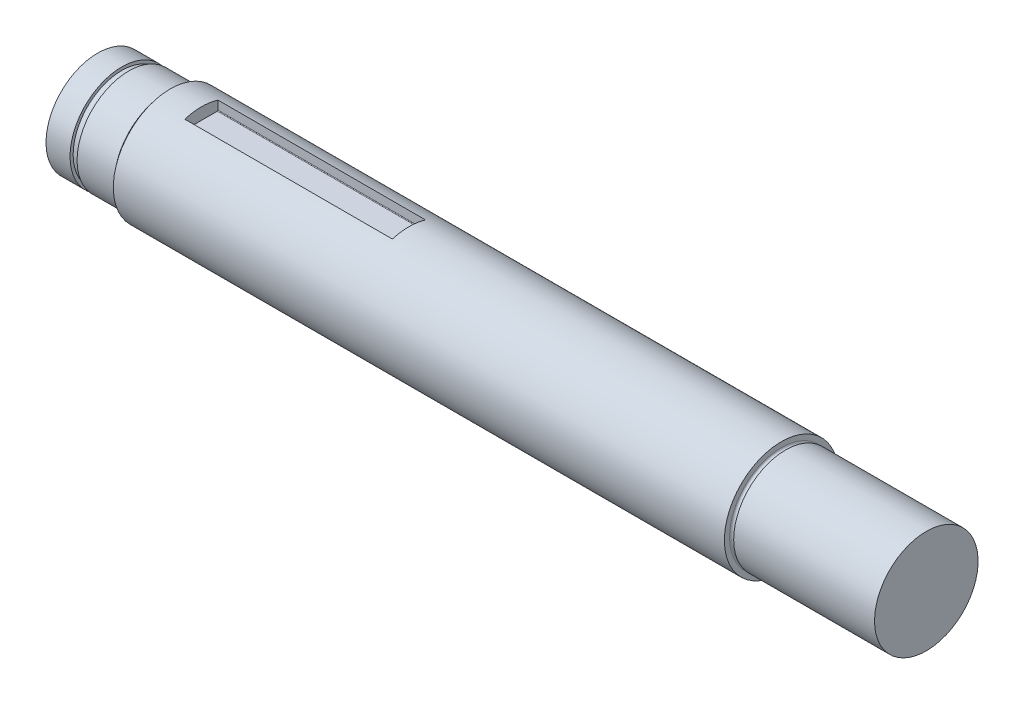
ISO-10303-21;
HEADER;
FILE_DESCRIPTION(('STEP AP214'),'2;1');
FILE_NAME('part.step','',(''),(''),'','','');
FILE_SCHEMA(('AUTOMOTIVE_DESIGN { 1 0 10303 214 1 1 1 1 }'));
ENDSEC;
DATA;
#1=APPLICATION_CONTEXT('core data for automotive mechanical design processes');
#2=APPLICATION_PROTOCOL_DEFINITION('international standard','automotive_design',2000,#1);
#3=PRODUCT_CONTEXT('',#1,'mechanical');
#4=PRODUCT('Part','Part','',(#3));
#5=PRODUCT_RELATED_PRODUCT_CATEGORY('part','',(#4));
#6=PRODUCT_DEFINITION_FORMATION('','',#4);
#7=PRODUCT_DEFINITION_CONTEXT('part definition',#1,'design');
#8=PRODUCT_DEFINITION('design','',#6,#7);
#9=PRODUCT_DEFINITION_SHAPE('','',#8);
#10=(LENGTH_UNIT() NAMED_UNIT(*) SI_UNIT(.MILLI.,.METRE.));
#11=(NAMED_UNIT(*) PLANE_ANGLE_UNIT() SI_UNIT($,.RADIAN.));
#12=(NAMED_UNIT(*) SI_UNIT($,.STERADIAN.) SOLID_ANGLE_UNIT());
#13=UNCERTAINTY_MEASURE_WITH_UNIT(LENGTH_MEASURE(1.E-05),#10,'distance_accuracy_value','');
#14=(GEOMETRIC_REPRESENTATION_CONTEXT(3) GLOBAL_UNCERTAINTY_ASSIGNED_CONTEXT((#13)) GLOBAL_UNIT_ASSIGNED_CONTEXT((#10,
#11,#12)) REPRESENTATION_CONTEXT('',''));
#15=CARTESIAN_POINT('',(0.,0.,0.));
#16=DIRECTION('',(0.,0.,1.));
#17=DIRECTION('',(1.,0.,0.));
#18=AXIS2_PLACEMENT_3D('',#15,#16,#17);
#19=CARTESIAN_POINT('',(175.,0.,0.));
#20=DIRECTION('',(-1.,0.,0.));
#21=DIRECTION('',(0.,0.,1.));
#22=AXIS2_PLACEMENT_3D('',#19,#20,#21);
#23=CYLINDRICAL_SURFACE('',#22,25.);
#24=CARTESIAN_POINT('',(-102.,0.,0.));
#25=DIRECTION('',(-1.,0.,0.));
#26=DIRECTION('',(0.,0.,1.));
#27=AXIS2_PLACEMENT_3D('',#24,#25,#26);
#28=CIRCLE('',#27,25.);
#29=CARTESIAN_POINT('',(-102.,0.,25.));
#30=VERTEX_POINT('',#29);
#31=EDGE_CURVE('E154',#30,#30,#28,.T.);
#32=ORIENTED_EDGE('',*,*,#31,.T.);
#33=EDGE_LOOP('',(#32));
#34=FACE_BOUND('',#33,.T.);
#35=CARTESIAN_POINT('',(-120.,0.,0.));
#36=DIRECTION('',(-1.,0.,0.));
#37=DIRECTION('',(0.,0.,1.));
#38=AXIS2_PLACEMENT_3D('',#35,#36,#37);
#39=CIRCLE('',#38,25.);
#40=CARTESIAN_POINT('',(-120.,0.,25.));
#41=VERTEX_POINT('',#40);
#42=EDGE_CURVE('E181',#41,#41,#39,.T.);
#43=ORIENTED_EDGE('',*,*,#42,.F.);
#44=EDGE_LOOP('',(#43));
#45=FACE_BOUND('',#44,.T.);
#46=ADVANCED_FACE('F39',(#34,#45),#23,.T.);
#47=CARTESIAN_POINT('',(100.,0.,0.));
#48=DIRECTION('',(-1.,0.,0.));
#49=DIRECTION('',(0.,0.,1.));
#50=AXIS2_PLACEMENT_3D('',#47,#48,#49);
#51=CYLINDRICAL_SURFACE('',#50,27.5);
#52=CARTESIAN_POINT('',(195.,0.,0.));
#53=DIRECTION('',(1.,0.,0.));
#54=DIRECTION('',(0.,0.,-1.));
#55=AXIS2_PLACEMENT_3D('',#52,#53,#54);
#56=CIRCLE('',#55,27.5);
#57=CARTESIAN_POINT('',(195.,0.,-27.5));
#58=VERTEX_POINT('',#57);
#59=EDGE_CURVE('E47',#58,#58,#56,.T.);
#60=ORIENTED_EDGE('',*,*,#59,.F.);
#61=EDGE_LOOP('',(#60));
#62=FACE_BOUND('',#61,.T.);
#63=CARTESIAN_POINT('',(-100.,0.,0.));
#64=DIRECTION('',(1.,0.,0.));
#65=DIRECTION('',(0.,0.,-1.));
#66=AXIS2_PLACEMENT_3D('',#63,#64,#65);
#67=CIRCLE('',#66,27.5);
#68=CARTESIAN_POINT('',(-100.,0.,-27.5));
#69=VERTEX_POINT('',#68);
#70=EDGE_CURVE('E11',#69,#69,#67,.T.);
#71=ORIENTED_EDGE('',*,*,#70,.T.);
#72=EDGE_LOOP('',(#71));
#73=FACE_BOUND('',#72,.T.);
#74=CARTESIAN_POINT('',(15.215,0.,0.));
#75=DIRECTION('',(-1.,0.,0.));
#76=DIRECTION('',(0.,0.,1.));
#77=AXIS2_PLACEMENT_3D('',#74,#75,#76);
#78=CIRCLE('',#77,27.5);
#79=CARTESIAN_POINT('',(15.215,26.3106442338457,8.));
#80=VERTEX_POINT('',#79);
#81=CARTESIAN_POINT('',(15.215,26.3106442338457,-8.));
#82=VERTEX_POINT('',#81);
#83=EDGE_CURVE('E142',#80,#82,#78,.T.);
#84=ORIENTED_EDGE('',*,*,#83,.F.);
#85=DIRECTION('',(-1.,0.,0.));
#86=VECTOR('',#85,1.);
#87=CARTESIAN_POINT('',(15.215,26.3106442338457,8.));
#88=LINE('',#87,#86);
#89=CARTESIAN_POINT('',(-85.,26.3106442338457,8.));
#90=VERTEX_POINT('',#89);
#91=EDGE_CURVE('E63',#80,#90,#88,.T.);
#92=ORIENTED_EDGE('',*,*,#91,.T.);
#93=CARTESIAN_POINT('',(-85.,0.,0.));
#94=DIRECTION('',(-1.,0.,0.));
#95=DIRECTION('',(0.,0.,1.));
#96=AXIS2_PLACEMENT_3D('',#93,#94,#95);
#97=CIRCLE('',#96,27.5);
#98=CARTESIAN_POINT('',(-85.,26.3106442338457,-8.));
#99=VERTEX_POINT('',#98);
#100=EDGE_CURVE('E85',#90,#99,#97,.T.);
#101=ORIENTED_EDGE('',*,*,#100,.T.);
#102=DIRECTION('',(-1.,0.,0.));
#103=VECTOR('',#102,1.);
#104=CARTESIAN_POINT('',(15.215,26.3106442338457,-8.));
#105=LINE('',#104,#103);
#106=EDGE_CURVE('E130',#82,#99,#105,.T.);
#107=ORIENTED_EDGE('',*,*,#106,.F.);
#108=EDGE_LOOP('',(#84,#92,#101,#107));
#109=FACE_BOUND('',#108,.T.);
#110=ADVANCED_FACE('F41',(#62,#73,#109),#51,.T.);
#111=CARTESIAN_POINT('',(-101.,0.,0.));
#112=DIRECTION('',(-1.,0.,0.));
#113=DIRECTION('',(0.,0.,1.));
#114=AXIS2_PLACEMENT_3D('',#111,#112,#113);
#115=TOROIDAL_SURFACE('',#114,25.,1.);
#116=CARTESIAN_POINT('',(-100.,0.,0.));
#117=DIRECTION('',(-1.,0.,0.));
#118=DIRECTION('',(0.,0.,1.));
#119=AXIS2_PLACEMENT_3D('',#116,#117,#118);
#120=CIRCLE('',#119,25.);
#121=CARTESIAN_POINT('',(-100.,0.,25.));
#122=VERTEX_POINT('',#121);
#123=EDGE_CURVE('E144',#122,#122,#120,.T.);
#124=ORIENTED_EDGE('',*,*,#123,.T.);
#125=EDGE_LOOP('',(#124));
#126=FACE_BOUND('',#125,.T.);
#127=ORIENTED_EDGE('',*,*,#31,.F.);
#128=EDGE_LOOP('',(#127));
#129=FACE_BOUND('',#128,.T.);
#130=ADVANCED_FACE('F171',(#126,#129),#115,.F.);
#131=CARTESIAN_POINT('',(-100.,0.,0.));
#132=DIRECTION('',(1.,0.,0.));
#133=DIRECTION('',(0.,0.,-1.));
#134=AXIS2_PLACEMENT_3D('',#131,#132,#133);
#135=PLANE('',#134);
#136=ORIENTED_EDGE('',*,*,#123,.F.);
#137=EDGE_LOOP('',(#136));
#138=FACE_BOUND('',#137,.T.);
#139=ORIENTED_EDGE('',*,*,#70,.F.);
#140=EDGE_LOOP('',(#139));
#141=FACE_BOUND('',#140,.T.);
#142=ADVANCED_FACE('F259',(#138,#141),#135,.F.);
#143=CARTESIAN_POINT('',(195.,0.,0.));
#144=DIRECTION('',(1.,0.,0.));
#145=DIRECTION('',(0.,0.,-1.));
#146=AXIS2_PLACEMENT_3D('',#143,#144,#145);
#147=PLANE('',#146);
#148=ORIENTED_EDGE('',*,*,#59,.T.);
#149=EDGE_LOOP('',(#148));
#150=FACE_BOUND('',#149,.T.);
#151=CARTESIAN_POINT('',(195.,0.,0.));
#152=DIRECTION('',(-1.,0.,0.));
#153=DIRECTION('',(0.,0.,1.));
#154=AXIS2_PLACEMENT_3D('',#151,#152,#153);
#155=CIRCLE('',#154,25.);
#156=CARTESIAN_POINT('',(195.,0.,25.));
#157=VERTEX_POINT('',#156);
#158=EDGE_CURVE('E150',#157,#157,#155,.T.);
#159=ORIENTED_EDGE('',*,*,#158,.T.);
#160=EDGE_LOOP('',(#159));
#161=FACE_BOUND('',#160,.T.);
#162=ADVANCED_FACE('F166',(#150,#161),#147,.T.);
#163=CARTESIAN_POINT('',(196.,0.,0.));
#164=DIRECTION('',(-1.,0.,0.));
#165=DIRECTION('',(0.,0.,1.));
#166=AXIS2_PLACEMENT_3D('',#163,#164,#165);
#167=TOROIDAL_SURFACE('',#166,25.,1.);
#168=CARTESIAN_POINT('',(197.,0.,0.));
#169=DIRECTION('',(-1.,0.,0.));
#170=DIRECTION('',(0.,0.,1.));
#171=AXIS2_PLACEMENT_3D('',#168,#169,#170);
#172=CIRCLE('',#171,25.);
#173=CARTESIAN_POINT('',(197.,0.,25.));
#174=VERTEX_POINT('',#173);
#175=EDGE_CURVE('E153',#174,#174,#172,.T.);
#176=ORIENTED_EDGE('',*,*,#175,.T.);
#177=EDGE_LOOP('',(#176));
#178=FACE_BOUND('',#177,.T.);
#179=ORIENTED_EDGE('',*,*,#158,.F.);
#180=EDGE_LOOP('',(#179));
#181=FACE_BOUND('',#180,.T.);
#182=ADVANCED_FACE('F252',(#178,#181),#167,.F.);
#183=CARTESIAN_POINT('',(265.,0.,0.));
#184=DIRECTION('',(1.,0.,0.));
#185=DIRECTION('',(0.,0.,-1.));
#186=AXIS2_PLACEMENT_3D('',#183,#184,#185);
#187=PLANE('',#186);
#188=CARTESIAN_POINT('',(265.,0.,0.));
#189=DIRECTION('',(1.,0.,0.));
#190=DIRECTION('',(0.,0.,-1.));
#191=AXIS2_PLACEMENT_3D('',#188,#189,#190);
#192=CIRCLE('',#191,25.);
#193=CARTESIAN_POINT('',(265.,0.,25.));
#194=VERTEX_POINT('',#193);
#195=EDGE_CURVE('E157',#194,#194,#192,.T.);
#196=ORIENTED_EDGE('',*,*,#195,.T.);
#197=EDGE_LOOP('',(#196));
#198=FACE_BOUND('',#197,.T.);
#199=ADVANCED_FACE('F255',(#198),#187,.T.);
#200=CARTESIAN_POINT('',(265.,0.,0.));
#201=DIRECTION('',(-1.,0.,0.));
#202=DIRECTION('',(0.,0.,1.));
#203=AXIS2_PLACEMENT_3D('',#200,#201,#202);
#204=CYLINDRICAL_SURFACE('',#203,25.);
#205=CARTESIAN_POINT('',(265.,0.,25.));
#206=CARTESIAN_POINT('',(264.291666666667,0.,25.));
#207=CARTESIAN_POINT('',(263.583333333333,0.,25.));
#208=CARTESIAN_POINT('',(262.166666666667,0.,25.));
#209=CARTESIAN_POINT('',(261.458333333333,0.,25.));
#210=CARTESIAN_POINT('',(260.041666666667,0.,25.));
#211=CARTESIAN_POINT('',(259.333333333333,0.,25.));
#212=CARTESIAN_POINT('',(257.916666666667,0.,25.));
#213=CARTESIAN_POINT('',(257.208333333333,0.,25.));
#214=CARTESIAN_POINT('',(255.791666666667,0.,25.));
#215=CARTESIAN_POINT('',(255.083333333333,0.,25.));
#216=CARTESIAN_POINT('',(253.666666666667,0.,25.));
#217=CARTESIAN_POINT('',(252.958333333333,0.,25.));
#218=CARTESIAN_POINT('',(251.541666666667,0.,25.));
#219=CARTESIAN_POINT('',(250.833333333333,0.,25.));
#220=CARTESIAN_POINT('',(249.416666666667,0.,25.));
#221=CARTESIAN_POINT('',(248.708333333333,0.,25.));
#222=CARTESIAN_POINT('',(247.291666666667,0.,25.));
#223=CARTESIAN_POINT('',(246.583333333333,0.,25.));
#224=CARTESIAN_POINT('',(245.166666666667,0.,25.));
#225=CARTESIAN_POINT('',(244.458333333333,0.,25.));
#226=CARTESIAN_POINT('',(243.041666666667,0.,25.));
#227=CARTESIAN_POINT('',(242.333333333333,0.,25.));
#228=CARTESIAN_POINT('',(240.916666666667,0.,25.));
#229=CARTESIAN_POINT('',(240.208333333333,0.,25.));
#230=CARTESIAN_POINT('',(238.791666666667,0.,25.));
#231=CARTESIAN_POINT('',(238.083333333333,0.,25.));
#232=CARTESIAN_POINT('',(236.666666666667,0.,25.));
#233=CARTESIAN_POINT('',(235.958333333333,0.,25.));
#234=CARTESIAN_POINT('',(234.541666666667,0.,25.));
#235=CARTESIAN_POINT('',(233.833333333333,0.,25.));
#236=CARTESIAN_POINT('',(232.416666666667,0.,25.));
#237=CARTESIAN_POINT('',(231.708333333333,0.,25.));
#238=CARTESIAN_POINT('',(230.291666666667,0.,25.));
#239=CARTESIAN_POINT('',(229.583333333333,0.,25.));
#240=CARTESIAN_POINT('',(228.166666666667,0.,25.));
#241=CARTESIAN_POINT('',(227.458333333333,0.,25.));
#242=CARTESIAN_POINT('',(226.041666666667,0.,25.));
#243=CARTESIAN_POINT('',(225.333333333333,0.,25.));
#244=CARTESIAN_POINT('',(223.916666666667,0.,25.));
#245=CARTESIAN_POINT('',(223.208333333333,0.,25.));
#246=CARTESIAN_POINT('',(221.791666666667,0.,25.));
#247=CARTESIAN_POINT('',(221.083333333333,0.,25.));
#248=CARTESIAN_POINT('',(219.666666666667,0.,25.));
#249=CARTESIAN_POINT('',(218.958333333333,0.,25.));
#250=CARTESIAN_POINT('',(217.541666666667,0.,25.));
#251=CARTESIAN_POINT('',(216.833333333333,0.,25.));
#252=CARTESIAN_POINT('',(215.416666666667,0.,25.));
#253=CARTESIAN_POINT('',(214.708333333333,0.,25.));
#254=CARTESIAN_POINT('',(213.291666666667,0.,25.));
#255=CARTESIAN_POINT('',(212.583333333333,0.,25.));
#256=CARTESIAN_POINT('',(211.166666666667,0.,25.));
#257=CARTESIAN_POINT('',(210.458333333333,0.,25.));
#258=CARTESIAN_POINT('',(209.041666666667,0.,25.));
#259=CARTESIAN_POINT('',(208.333333333333,0.,25.));
#260=CARTESIAN_POINT('',(206.916666666667,0.,25.));
#261=CARTESIAN_POINT('',(206.208333333333,0.,25.));
#262=CARTESIAN_POINT('',(204.791666666667,0.,25.));
#263=CARTESIAN_POINT('',(204.083333333333,0.,25.));
#264=CARTESIAN_POINT('',(202.666666666667,0.,25.));
#265=CARTESIAN_POINT('',(201.958333333333,0.,25.));
#266=CARTESIAN_POINT('',(200.541666666667,0.,25.));
#267=CARTESIAN_POINT('',(199.833333333333,0.,25.));
#268=CARTESIAN_POINT('',(198.416666666667,0.,25.));
#269=CARTESIAN_POINT('',(197.708333333333,0.,25.));
#270=CARTESIAN_POINT('',(197.,0.,25.));
#271=B_SPLINE_CURVE_WITH_KNOTS('',3,(#205,#206,#207,#208,#209,#210,#211,#212,#213,#214,#215,
#216,#217,#218,#219,#220,#221,#222,#223,#224,#225,#226,#227,#228,#229,#230,#231,#232,#233,#234,
#235,#236,#237,#238,#239,#240,#241,#242,#243,#244,#245,#246,#247,#248,#249,#250,#251,#252,#253,
#254,#255,#256,#257,#258,#259,#260,#261,#262,#263,#264,#265,#266,#267,#268,#269,#270),
.UNSPECIFIED.,.F.,.F.,(4,2,2,2,2,2,2,2,2,2,2,2,2,2,2,2,2,2,2,2,2,2,2,2,2,2,2,2,2,2,2,2,4),(0.,
2.12500000000004,4.25000000000003,6.37500000000002,8.50000000000001,10.625,12.75,14.875,17.,
19.125,21.25,23.375,25.5,27.625,29.75,31.875,34.,36.125,38.25,40.375,42.5,44.625,46.75,48.875,
51.,53.125,55.25,57.375,59.5,61.625,63.75,65.875,68.),.UNSPECIFIED.);
#272=EDGE_CURVE('BSEAM241',#194,#174,#271,.T.);
#273=ORIENTED_EDGE('',*,*,#195,.F.);
#274=ORIENTED_EDGE('',*,*,#175,.F.);
#275=ORIENTED_EDGE('',*,*,#272,.T.);
#276=ORIENTED_EDGE('',*,*,#272,.F.);
#277=EDGE_LOOP('',(#273,#275,#274,#276));
#278=FACE_BOUND('',#277,.T.);
#279=ADVANCED_FACE('F241',(#278),#204,.T.);
#280=CARTESIAN_POINT('',(15.215,22.1,8.));
#281=DIRECTION('',(0.,0.,1.));
#282=DIRECTION('',(0.,-1.,0.));
#283=AXIS2_PLACEMENT_3D('',#280,#281,#282);
#284=PLANE('',#283);
#285=DIRECTION('',(0.,1.,0.));
#286=VECTOR('',#285,1.);
#287=CARTESIAN_POINT('',(-85.,22.1,8.));
#288=LINE('',#287,#286);
#289=CARTESIAN_POINT('',(-85.,22.1,8.));
#290=VERTEX_POINT('',#289);
#291=EDGE_CURVE('E140',#290,#90,#288,.T.);
#292=ORIENTED_EDGE('',*,*,#291,.T.);
#293=ORIENTED_EDGE('',*,*,#91,.F.);
#294=DIRECTION('',(0.,1.,0.));
#295=VECTOR('',#294,1.);
#296=CARTESIAN_POINT('',(15.215,22.1,8.));
#297=LINE('',#296,#295);
#298=CARTESIAN_POINT('',(15.215,22.1,8.));
#299=VERTEX_POINT('',#298);
#300=EDGE_CURVE('E120',#299,#80,#297,.T.);
#301=ORIENTED_EDGE('',*,*,#300,.F.);
#302=DIRECTION('',(-1.,0.,0.));
#303=VECTOR('',#302,1.);
#304=CARTESIAN_POINT('',(15.215,22.1,8.));
#305=LINE('',#304,#303);
#306=EDGE_CURVE('E113',#299,#290,#305,.T.);
#307=ORIENTED_EDGE('',*,*,#306,.T.);
#308=EDGE_LOOP('',(#292,#293,#301,#307));
#309=FACE_BOUND('',#308,.T.);
#310=ADVANCED_FACE('F238',(#309),#284,.F.);
#311=CARTESIAN_POINT('',(15.215,22.1,7.7));
#312=DIRECTION('',(-1.,0.,0.));
#313=DIRECTION('',(0.,0.,1.));
#314=AXIS2_PLACEMENT_3D('',#311,#312,#313);
#315=CYLINDRICAL_SURFACE('',#314,0.3);
#316=CARTESIAN_POINT('',(-85.,22.1,7.7));
#317=DIRECTION('',(-1.,0.,0.));
#318=DIRECTION('',(0.,0.,1.));
#319=AXIS2_PLACEMENT_3D('',#316,#317,#318);
#320=CIRCLE('',#319,0.3);
#321=CARTESIAN_POINT('',(-85.,21.8,7.7));
#322=VERTEX_POINT('',#321);
#323=EDGE_CURVE('E138',#322,#290,#320,.T.);
#324=ORIENTED_EDGE('',*,*,#323,.T.);
#325=ORIENTED_EDGE('',*,*,#306,.F.);
#326=CARTESIAN_POINT('',(15.215,22.1,7.7));
#327=DIRECTION('',(-1.,0.,0.));
#328=DIRECTION('',(0.,0.,1.));
#329=AXIS2_PLACEMENT_3D('',#326,#327,#328);
#330=CIRCLE('',#329,0.3);
#331=CARTESIAN_POINT('',(15.215,21.8,7.7));
#332=VERTEX_POINT('',#331);
#333=EDGE_CURVE('E117',#332,#299,#330,.T.);
#334=ORIENTED_EDGE('',*,*,#333,.F.);
#335=DIRECTION('',(-1.,0.,0.));
#336=VECTOR('',#335,1.);
#337=CARTESIAN_POINT('',(15.215,21.8,7.7));
#338=LINE('',#337,#336);
#339=EDGE_CURVE('E102',#332,#322,#338,.T.);
#340=ORIENTED_EDGE('',*,*,#339,.T.);
#341=EDGE_LOOP('',(#324,#325,#334,#340));
#342=FACE_BOUND('',#341,.T.);
#343=ADVANCED_FACE('F118',(#342),#315,.F.);
#344=CARTESIAN_POINT('',(15.215,21.8,-7.7));
#345=DIRECTION('',(0.,-1.,0.));
#346=DIRECTION('',(0.,0.,-1.));
#347=AXIS2_PLACEMENT_3D('',#344,#345,#346);
#348=PLANE('',#347);
#349=DIRECTION('',(0.,0.,1.));
#350=VECTOR('',#349,1.);
#351=CARTESIAN_POINT('',(-85.,21.8,-7.7));
#352=LINE('',#351,#350);
#353=CARTESIAN_POINT('',(-85.,21.8,-7.7));
#354=VERTEX_POINT('',#353);
#355=EDGE_CURVE('E109',#354,#322,#352,.T.);
#356=ORIENTED_EDGE('',*,*,#355,.T.);
#357=ORIENTED_EDGE('',*,*,#339,.F.);
#358=DIRECTION('',(0.,0.,1.));
#359=VECTOR('',#358,1.);
#360=CARTESIAN_POINT('',(15.215,21.8,-7.7));
#361=LINE('',#360,#359);
#362=CARTESIAN_POINT('',(15.215,21.8,-7.7));
#363=VERTEX_POINT('',#362);
#364=EDGE_CURVE('E106',#363,#332,#361,.T.);
#365=ORIENTED_EDGE('',*,*,#364,.F.);
#366=DIRECTION('',(-1.,0.,0.));
#367=VECTOR('',#366,1.);
#368=CARTESIAN_POINT('',(15.215,21.8,-7.7));
#369=LINE('',#368,#367);
#370=EDGE_CURVE('E114',#363,#354,#369,.T.);
#371=ORIENTED_EDGE('',*,*,#370,.T.);
#372=EDGE_LOOP('',(#356,#357,#365,#371));
#373=FACE_BOUND('',#372,.T.);
#374=ADVANCED_FACE('F104',(#373),#348,.F.);
#375=CARTESIAN_POINT('',(15.215,22.1,-7.7));
#376=DIRECTION('',(-1.,0.,0.));
#377=DIRECTION('',(0.,0.,1.));
#378=AXIS2_PLACEMENT_3D('',#375,#376,#377);
#379=CYLINDRICAL_SURFACE('',#378,0.3);
#380=CARTESIAN_POINT('',(-85.,22.1,-7.7));
#381=DIRECTION('',(-1.,0.,0.));
#382=DIRECTION('',(0.,0.,1.));
#383=AXIS2_PLACEMENT_3D('',#380,#381,#382);
#384=CIRCLE('',#383,0.3);
#385=CARTESIAN_POINT('',(-85.,22.1,-8.));
#386=VERTEX_POINT('',#385);
#387=EDGE_CURVE('E134',#386,#354,#384,.T.);
#388=ORIENTED_EDGE('',*,*,#387,.T.);
#389=ORIENTED_EDGE('',*,*,#370,.F.);
#390=CARTESIAN_POINT('',(15.215,22.1,-7.7));
#391=DIRECTION('',(-1.,0.,0.));
#392=DIRECTION('',(0.,0.,1.));
#393=AXIS2_PLACEMENT_3D('',#390,#391,#392);
#394=CIRCLE('',#393,0.3);
#395=CARTESIAN_POINT('',(15.215,22.1,-8.));
#396=VERTEX_POINT('',#395);
#397=EDGE_CURVE('E124',#396,#363,#394,.T.);
#398=ORIENTED_EDGE('',*,*,#397,.F.);
#399=DIRECTION('',(-1.,0.,0.));
#400=VECTOR('',#399,1.);
#401=CARTESIAN_POINT('',(15.215,22.1,-8.));
#402=LINE('',#401,#400);
#403=EDGE_CURVE('E147',#396,#386,#402,.T.);
#404=ORIENTED_EDGE('',*,*,#403,.T.);
#405=EDGE_LOOP('',(#388,#389,#398,#404));
#406=FACE_BOUND('',#405,.T.);
#407=ADVANCED_FACE('F246',(#406),#379,.F.);
#408=CARTESIAN_POINT('',(15.215,26.3106442338457,-8.));
#409=DIRECTION('',(0.,0.,-1.));
#410=DIRECTION('',(0.,1.,0.));
#411=AXIS2_PLACEMENT_3D('',#408,#409,#410);
#412=PLANE('',#411);
#413=DIRECTION('',(0.,-1.,0.));
#414=VECTOR('',#413,1.);
#415=CARTESIAN_POINT('',(-85.,26.3106442338457,-8.));
#416=LINE('',#415,#414);
#417=EDGE_CURVE('E54',#99,#386,#416,.T.);
#418=ORIENTED_EDGE('',*,*,#417,.T.);
#419=ORIENTED_EDGE('',*,*,#403,.F.);
#420=DIRECTION('',(0.,-1.,0.));
#421=VECTOR('',#420,1.);
#422=CARTESIAN_POINT('',(15.215,26.3106442338457,-8.));
#423=LINE('',#422,#421);
#424=EDGE_CURVE('E92',#82,#396,#423,.T.);
#425=ORIENTED_EDGE('',*,*,#424,.F.);
#426=ORIENTED_EDGE('',*,*,#106,.T.);
#427=EDGE_LOOP('',(#418,#419,#425,#426));
#428=FACE_BOUND('',#427,.T.);
#429=ADVANCED_FACE('F235',(#428),#412,.F.);
#430=CARTESIAN_POINT('',(15.215,0.,0.));
#431=DIRECTION('',(-1.,0.,0.));
#432=DIRECTION('',(0.,0.,1.));
#433=AXIS2_PLACEMENT_3D('',#430,#431,#432);
#434=PLANE('',#433);
#435=ORIENTED_EDGE('',*,*,#83,.T.);
#436=ORIENTED_EDGE('',*,*,#424,.T.);
#437=ORIENTED_EDGE('',*,*,#397,.T.);
#438=ORIENTED_EDGE('',*,*,#364,.T.);
#439=ORIENTED_EDGE('',*,*,#333,.T.);
#440=ORIENTED_EDGE('',*,*,#300,.T.);
#441=EDGE_LOOP('',(#435,#436,#437,#438,#439,#440));
#442=FACE_BOUND('',#441,.T.);
#443=ADVANCED_FACE('F122',(#442),#434,.T.);
#444=CARTESIAN_POINT('',(-85.,0.,0.));
#445=DIRECTION('',(-1.,0.,0.));
#446=DIRECTION('',(0.,0.,1.));
#447=AXIS2_PLACEMENT_3D('',#444,#445,#446);
#448=PLANE('',#447);
#449=ORIENTED_EDGE('',*,*,#100,.F.);
#450=ORIENTED_EDGE('',*,*,#291,.F.);
#451=ORIENTED_EDGE('',*,*,#323,.F.);
#452=ORIENTED_EDGE('',*,*,#355,.F.);
#453=ORIENTED_EDGE('',*,*,#387,.F.);
#454=ORIENTED_EDGE('',*,*,#417,.F.);
#455=EDGE_LOOP('',(#449,#450,#451,#452,#453,#454));
#456=FACE_BOUND('',#455,.T.);
#457=ADVANCED_FACE('F209',(#456),#448,.F.);
#458=CARTESIAN_POINT('',(-123.4,0.,0.));
#459=DIRECTION('',(-1.,0.,0.));
#460=DIRECTION('',(0.,0.,1.));
#461=AXIS2_PLACEMENT_3D('',#458,#459,#460);
#462=PLANE('',#461);
#463=CARTESIAN_POINT('',(-123.4,0.,0.));
#464=DIRECTION('',(-1.,0.,0.));
#465=DIRECTION('',(0.,0.,1.));
#466=AXIS2_PLACEMENT_3D('',#463,#464,#465);
#467=CIRCLE('',#466,25.);
#468=CARTESIAN_POINT('',(-123.4,0.,25.));
#469=VERTEX_POINT('',#468);
#470=EDGE_CURVE('E180',#469,#469,#467,.T.);
#471=ORIENTED_EDGE('',*,*,#470,.F.);
#472=EDGE_LOOP('',(#471));
#473=FACE_BOUND('',#472,.T.);
#474=CARTESIAN_POINT('',(-123.4,0.,0.));
#475=DIRECTION('',(-1.,0.,0.));
#476=DIRECTION('',(0.,0.,1.));
#477=AXIS2_PLACEMENT_3D('',#474,#475,#476);
#478=CIRCLE('',#477,23.5);
#479=CARTESIAN_POINT('',(-123.4,0.,23.5));
#480=VERTEX_POINT('',#479);
#481=EDGE_CURVE('E184',#480,#480,#478,.T.);
#482=ORIENTED_EDGE('',*,*,#481,.T.);
#483=EDGE_LOOP('',(#482));
#484=FACE_BOUND('',#483,.T.);
#485=ADVANCED_FACE('F193',(#473,#484),#462,.F.);
#486=CARTESIAN_POINT('',(-120.,0.,0.));
#487=DIRECTION('',(-1.,0.,0.));
#488=DIRECTION('',(0.,0.,1.));
#489=AXIS2_PLACEMENT_3D('',#486,#487,#488);
#490=PLANE('',#489);
#491=ORIENTED_EDGE('',*,*,#42,.T.);
#492=EDGE_LOOP('',(#491));
#493=FACE_BOUND('',#492,.T.);
#494=CARTESIAN_POINT('',(-120.,0.,0.));
#495=DIRECTION('',(-1.,0.,0.));
#496=DIRECTION('',(0.,0.,1.));
#497=AXIS2_PLACEMENT_3D('',#494,#495,#496);
#498=CIRCLE('',#497,23.5);
#499=CARTESIAN_POINT('',(-120.,0.,23.5));
#500=VERTEX_POINT('',#499);
#501=EDGE_CURVE('E187',#500,#500,#498,.T.);
#502=ORIENTED_EDGE('',*,*,#501,.F.);
#503=EDGE_LOOP('',(#502));
#504=FACE_BOUND('',#503,.T.);
#505=ADVANCED_FACE('F199',(#493,#504),#490,.T.);
#506=CARTESIAN_POINT('',(-123.4,0.,0.));
#507=DIRECTION('',(1.,0.,0.));
#508=DIRECTION('',(0.,0.,-1.));
#509=AXIS2_PLACEMENT_3D('',#506,#507,#508);
#510=CYLINDRICAL_SURFACE('',#509,23.5);
#511=ORIENTED_EDGE('',*,*,#481,.F.);
#512=EDGE_LOOP('',(#511));
#513=FACE_BOUND('',#512,.T.);
#514=ORIENTED_EDGE('',*,*,#501,.T.);
#515=EDGE_LOOP('',(#514));
#516=FACE_BOUND('',#515,.T.);
#517=ADVANCED_FACE('F195',(#513,#516),#510,.T.);
#518=CARTESIAN_POINT('',(-135.,0.,0.));
#519=DIRECTION('',(-1.,0.,0.));
#520=DIRECTION('',(0.,0.,1.));
#521=AXIS2_PLACEMENT_3D('',#518,#519,#520);
#522=PLANE('',#521);
#523=CARTESIAN_POINT('',(-135.,0.,0.));
#524=DIRECTION('',(-1.,0.,0.));
#525=DIRECTION('',(0.,0.,1.));
#526=AXIS2_PLACEMENT_3D('',#523,#524,#525);
#527=CIRCLE('',#526,25.);
#528=CARTESIAN_POINT('',(-135.,0.,25.));
#529=VERTEX_POINT('',#528);
#530=EDGE_CURVE('E132',#529,#529,#527,.T.);
#531=ORIENTED_EDGE('',*,*,#530,.T.);
#532=EDGE_LOOP('',(#531));
#533=FACE_BOUND('',#532,.T.);
#534=ADVANCED_FACE('F198',(#533),#522,.T.);
#535=ORIENTED_EDGE('',*,*,#470,.T.);
#536=EDGE_LOOP('',(#535));
#537=FACE_BOUND('',#536,.T.);
#538=ORIENTED_EDGE('',*,*,#530,.F.);
#539=EDGE_LOOP('',(#538));
#540=FACE_BOUND('',#539,.T.);
#541=ADVANCED_FACE('F216',(#537,#540),#23,.T.);
#542=CLOSED_SHELL('',(#46,#110,#130,#142,#162,#182,#199,#279,#310,#343,#374,#407,#429,#443,#457,
#485,#505,#517,#534,#541));
#543=MANIFOLD_SOLID_BREP('B2',#542);
#544=ADVANCED_BREP_SHAPE_REPRESENTATION('',(#18,#543),#14);
#545=SHAPE_DEFINITION_REPRESENTATION(#9,#544);
ENDSEC;
END-ISO-10303-21;
